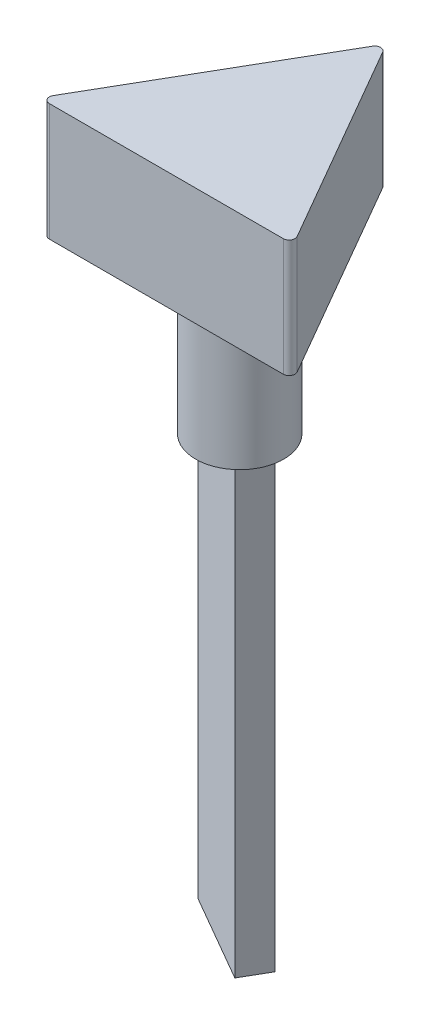
ISO-10303-21;
HEADER;
FILE_DESCRIPTION(('STEP AP214'),'2;1');
FILE_NAME('part.step','',(''),(''),'','','');
FILE_SCHEMA(('AUTOMOTIVE_DESIGN { 1 0 10303 214 1 1 1 1 }'));
ENDSEC;
DATA;
#1=APPLICATION_CONTEXT('core data for automotive mechanical design processes');
#2=APPLICATION_PROTOCOL_DEFINITION('international standard','automotive_design',2000,#1);
#3=PRODUCT_CONTEXT('',#1,'mechanical');
#4=PRODUCT('Part','Part','',(#3));
#5=PRODUCT_RELATED_PRODUCT_CATEGORY('part','',(#4));
#6=PRODUCT_DEFINITION_FORMATION('','',#4);
#7=PRODUCT_DEFINITION_CONTEXT('part definition',#1,'design');
#8=PRODUCT_DEFINITION('design','',#6,#7);
#9=PRODUCT_DEFINITION_SHAPE('','',#8);
#10=(LENGTH_UNIT() NAMED_UNIT(*) SI_UNIT(.MILLI.,.METRE.));
#11=(NAMED_UNIT(*) PLANE_ANGLE_UNIT() SI_UNIT($,.RADIAN.));
#12=(NAMED_UNIT(*) SI_UNIT($,.STERADIAN.) SOLID_ANGLE_UNIT());
#13=UNCERTAINTY_MEASURE_WITH_UNIT(LENGTH_MEASURE(1.E-05),#10,'distance_accuracy_value','');
#14=(GEOMETRIC_REPRESENTATION_CONTEXT(3) GLOBAL_UNCERTAINTY_ASSIGNED_CONTEXT((#13)) GLOBAL_UNIT_ASSIGNED_CONTEXT((#10,
#11,#12)) REPRESENTATION_CONTEXT('',''));
#15=CARTESIAN_POINT('',(0.,0.,0.));
#16=DIRECTION('',(0.,0.,1.));
#17=DIRECTION('',(1.,0.,0.));
#18=AXIS2_PLACEMENT_3D('',#15,#16,#17);
#19=CARTESIAN_POINT('',(0.,-5.,0.));
#20=DIRECTION('',(0.,-1.,0.));
#21=DIRECTION('',(0.,0.,-1.));
#22=AXIS2_PLACEMENT_3D('',#19,#20,#21);
#23=PLANE('',#22);
#24=DIRECTION('',(-0.866025403784439,0.,-0.5));
#25=VECTOR('',#24,1.);
#26=CARTESIAN_POINT('',(-1.98205080756888,-5.,-0.566987298107781));
#27=LINE('',#26,#25);
#28=CARTESIAN_POINT('',(0.974744871391589,-5.,1.14011948307877));
#29=VERTEX_POINT('',#28);
#30=CARTESIAN_POINT('',(-1.47474487139159,-5.,-0.274094079294329));
#31=VERTEX_POINT('',#30);
#32=EDGE_CURVE('E141',#29,#31,#27,.T.);
#33=ORIENTED_EDGE('',*,*,#32,.F.);
#34=CARTESIAN_POINT('',(0.,-5.,0.));
#35=DIRECTION('',(0.,-1.,0.));
#36=DIRECTION('',(0.,0.,-1.));
#37=AXIS2_PLACEMENT_3D('',#34,#35,#36);
#38=CIRCLE('',#37,1.5);
#39=EDGE_CURVE('E156',#29,#31,#38,.T.);
#40=ORIENTED_EDGE('',*,*,#39,.T.);
#41=EDGE_LOOP('',(#33,#40));
#42=FACE_BOUND('',#41,.T.);
#43=ADVANCED_FACE('F35',(#42),#23,.T.);
#44=DIRECTION('',(-0.5,0.,0.866025403784439));
#45=VECTOR('',#44,1.);
#46=CARTESIAN_POINT('',(0.974744871391589,-5.,1.14011948307877));
#47=LINE('',#46,#45);
#48=CARTESIAN_POINT('',(1.47474487139159,-5.,0.274094079294328));
#49=VERTEX_POINT('',#48);
#50=EDGE_CURVE('E265',#49,#29,#47,.T.);
#51=ORIENTED_EDGE('',*,*,#50,.F.);
#52=EDGE_CURVE('E149',#49,#29,#38,.T.);
#53=ORIENTED_EDGE('',*,*,#52,.T.);
#54=EDGE_LOOP('',(#51,#53));
#55=FACE_BOUND('',#54,.T.);
#56=ADVANCED_FACE('F244',(#55),#23,.T.);
#57=CARTESIAN_POINT('',(3.98371685740842,4.,2.3));
#58=DIRECTION('',(0.,-1.,0.));
#59=DIRECTION('',(0.,0.,-1.));
#60=AXIS2_PLACEMENT_3D('',#57,#58,#59);
#61=CYLINDRICAL_SURFACE('',#60,0.2);
#62=CARTESIAN_POINT('',(3.98371685740842,0.,2.3));
#63=DIRECTION('',(0.,1.,0.));
#64=DIRECTION('',(0.,0.,1.));
#65=AXIS2_PLACEMENT_3D('',#62,#63,#64);
#66=CIRCLE('',#65,0.2);
#67=CARTESIAN_POINT('',(3.98371685740842,0.,2.5));
#68=VERTEX_POINT('',#67);
#69=CARTESIAN_POINT('',(4.15692193816531,0.,2.2));
#70=VERTEX_POINT('',#69);
#71=EDGE_CURVE('E155',#68,#70,#66,.T.);
#72=ORIENTED_EDGE('',*,*,#71,.T.);
#73=DIRECTION('',(0.,-1.,0.));
#74=VECTOR('',#73,1.);
#75=CARTESIAN_POINT('',(4.15692193816531,4.,2.2));
#76=LINE('',#75,#74);
#77=CARTESIAN_POINT('',(4.15692193816531,4.,2.2));
#78=VERTEX_POINT('',#77);
#79=EDGE_CURVE('E196',#78,#70,#76,.T.);
#80=ORIENTED_EDGE('',*,*,#79,.F.);
#81=CARTESIAN_POINT('',(3.98371685740842,4.,2.3));
#82=DIRECTION('',(0.,1.,0.));
#83=DIRECTION('',(0.,0.,1.));
#84=AXIS2_PLACEMENT_3D('',#81,#82,#83);
#85=CIRCLE('',#84,0.2);
#86=CARTESIAN_POINT('',(3.98371685740842,4.,2.5));
#87=VERTEX_POINT('',#86);
#88=EDGE_CURVE('E157',#87,#78,#85,.T.);
#89=ORIENTED_EDGE('',*,*,#88,.F.);
#90=DIRECTION('',(0.,-1.,0.));
#91=VECTOR('',#90,1.);
#92=CARTESIAN_POINT('',(3.98371685740842,4.,2.5));
#93=LINE('',#92,#91);
#94=EDGE_CURVE('E171',#87,#68,#93,.T.);
#95=ORIENTED_EDGE('',*,*,#94,.T.);
#96=EDGE_LOOP('',(#72,#80,#89,#95));
#97=FACE_BOUND('',#96,.T.);
#98=ADVANCED_FACE('F37',(#97),#61,.T.);
#99=CARTESIAN_POINT('',(4.15692193816531,4.,2.2));
#100=DIRECTION('',(-0.866025403784439,0.,0.5));
#101=DIRECTION('',(0.5,0.,0.866025403784439));
#102=AXIS2_PLACEMENT_3D('',#99,#100,#101);
#103=PLANE('',#102);
#104=DIRECTION('',(-0.5,0.,-0.866025403784439));
#105=VECTOR('',#104,1.);
#106=CARTESIAN_POINT('',(4.15692193816531,0.,2.2));
#107=LINE('',#106,#105);
#108=CARTESIAN_POINT('',(0.173205080756888,0.,-4.70000000000001));
#109=VERTEX_POINT('',#108);
#110=EDGE_CURVE('E174',#70,#109,#107,.T.);
#111=ORIENTED_EDGE('',*,*,#110,.T.);
#112=DIRECTION('',(0.,-1.,0.));
#113=VECTOR('',#112,1.);
#114=CARTESIAN_POINT('',(0.173205080756888,4.,-4.70000000000001));
#115=LINE('',#114,#113);
#116=CARTESIAN_POINT('',(0.173205080756888,4.,-4.70000000000001));
#117=VERTEX_POINT('',#116);
#118=EDGE_CURVE('E194',#117,#109,#115,.T.);
#119=ORIENTED_EDGE('',*,*,#118,.F.);
#120=DIRECTION('',(-0.5,0.,-0.866025403784439));
#121=VECTOR('',#120,1.);
#122=CARTESIAN_POINT('',(4.15692193816531,4.,2.2));
#123=LINE('',#122,#121);
#124=EDGE_CURVE('E160',#78,#117,#123,.T.);
#125=ORIENTED_EDGE('',*,*,#124,.F.);
#126=ORIENTED_EDGE('',*,*,#79,.T.);
#127=EDGE_LOOP('',(#111,#119,#125,#126));
#128=FACE_BOUND('',#127,.T.);
#129=ADVANCED_FACE('F234',(#128),#103,.F.);
#130=CARTESIAN_POINT('',(0.,4.,-4.6));
#131=DIRECTION('',(0.,-1.,0.));
#132=DIRECTION('',(0.,0.,-1.));
#133=AXIS2_PLACEMENT_3D('',#130,#131,#132);
#134=CYLINDRICAL_SURFACE('',#133,0.200000000000001);
#135=CARTESIAN_POINT('',(0.,0.,-4.6));
#136=DIRECTION('',(0.,1.,0.));
#137=DIRECTION('',(0.,0.,1.));
#138=AXIS2_PLACEMENT_3D('',#135,#136,#137);
#139=CIRCLE('',#138,0.200000000000001);
#140=CARTESIAN_POINT('',(-0.173205080756889,0.,-4.70000000000001));
#141=VERTEX_POINT('',#140);
#142=EDGE_CURVE('E176',#109,#141,#139,.T.);
#143=ORIENTED_EDGE('',*,*,#142,.T.);
#144=DIRECTION('',(0.,-1.,0.));
#145=VECTOR('',#144,1.);
#146=CARTESIAN_POINT('',(-0.173205080756889,4.,-4.70000000000001));
#147=LINE('',#146,#145);
#148=CARTESIAN_POINT('',(-0.173205080756889,4.,-4.70000000000001));
#149=VERTEX_POINT('',#148);
#150=EDGE_CURVE('E191',#149,#141,#147,.T.);
#151=ORIENTED_EDGE('',*,*,#150,.F.);
#152=CARTESIAN_POINT('',(0.,4.,-4.6));
#153=DIRECTION('',(0.,1.,0.));
#154=DIRECTION('',(0.,0.,1.));
#155=AXIS2_PLACEMENT_3D('',#152,#153,#154);
#156=CIRCLE('',#155,0.200000000000001);
#157=EDGE_CURVE('E163',#117,#149,#156,.T.);
#158=ORIENTED_EDGE('',*,*,#157,.F.);
#159=ORIENTED_EDGE('',*,*,#118,.T.);
#160=EDGE_LOOP('',(#143,#151,#158,#159));
#161=FACE_BOUND('',#160,.T.);
#162=ADVANCED_FACE('F232',(#161),#134,.T.);
#163=CARTESIAN_POINT('',(-0.173205080756889,4.,-4.70000000000001));
#164=DIRECTION('',(0.866025403784439,0.,0.5));
#165=DIRECTION('',(0.5,0.,-0.866025403784439));
#166=AXIS2_PLACEMENT_3D('',#163,#164,#165);
#167=PLANE('',#166);
#168=DIRECTION('',(-0.5,0.,0.866025403784439));
#169=VECTOR('',#168,1.);
#170=CARTESIAN_POINT('',(-0.173205080756889,0.,-4.70000000000001));
#171=LINE('',#170,#169);
#172=CARTESIAN_POINT('',(-4.15692193816531,0.,2.20000000000001));
#173=VERTEX_POINT('',#172);
#174=EDGE_CURVE('E178',#141,#173,#171,.T.);
#175=ORIENTED_EDGE('',*,*,#174,.T.);
#176=DIRECTION('',(0.,-1.,0.));
#177=VECTOR('',#176,1.);
#178=CARTESIAN_POINT('',(-4.15692193816531,4.,2.20000000000001));
#179=LINE('',#178,#177);
#180=CARTESIAN_POINT('',(-4.15692193816531,4.,2.20000000000001));
#181=VERTEX_POINT('',#180);
#182=EDGE_CURVE('E188',#181,#173,#179,.T.);
#183=ORIENTED_EDGE('',*,*,#182,.F.);
#184=DIRECTION('',(-0.5,0.,0.866025403784439));
#185=VECTOR('',#184,1.);
#186=CARTESIAN_POINT('',(-0.173205080756889,4.,-4.70000000000001));
#187=LINE('',#186,#185);
#188=EDGE_CURVE('E165',#149,#181,#187,.T.);
#189=ORIENTED_EDGE('',*,*,#188,.F.);
#190=ORIENTED_EDGE('',*,*,#150,.T.);
#191=EDGE_LOOP('',(#175,#183,#189,#190));
#192=FACE_BOUND('',#191,.T.);
#193=ADVANCED_FACE('F227',(#192),#167,.F.);
#194=CARTESIAN_POINT('',(-3.98371685740842,4.,2.3));
#195=DIRECTION('',(0.,-1.,0.));
#196=DIRECTION('',(0.,0.,-1.));
#197=AXIS2_PLACEMENT_3D('',#194,#195,#196);
#198=CYLINDRICAL_SURFACE('',#197,0.2);
#199=CARTESIAN_POINT('',(-3.98371685740842,0.,2.3));
#200=DIRECTION('',(0.,1.,0.));
#201=DIRECTION('',(0.,0.,-1.));
#202=AXIS2_PLACEMENT_3D('',#199,#200,#201);
#203=CIRCLE('',#202,0.2);
#204=CARTESIAN_POINT('',(-3.98371685740842,0.,2.5));
#205=VERTEX_POINT('',#204);
#206=EDGE_CURVE('E180',#173,#205,#203,.T.);
#207=ORIENTED_EDGE('',*,*,#206,.T.);
#208=DIRECTION('',(0.,-1.,0.));
#209=VECTOR('',#208,1.);
#210=CARTESIAN_POINT('',(-3.98371685740842,4.,2.5));
#211=LINE('',#210,#209);
#212=CARTESIAN_POINT('',(-3.98371685740842,4.,2.5));
#213=VERTEX_POINT('',#212);
#214=EDGE_CURVE('E185',#213,#205,#211,.T.);
#215=ORIENTED_EDGE('',*,*,#214,.F.);
#216=CARTESIAN_POINT('',(-3.98371685740842,4.,2.3));
#217=DIRECTION('',(0.,1.,0.));
#218=DIRECTION('',(0.,0.,-1.));
#219=AXIS2_PLACEMENT_3D('',#216,#217,#218);
#220=CIRCLE('',#219,0.2);
#221=EDGE_CURVE('E167',#181,#213,#220,.T.);
#222=ORIENTED_EDGE('',*,*,#221,.F.);
#223=ORIENTED_EDGE('',*,*,#182,.T.);
#224=EDGE_LOOP('',(#207,#215,#222,#223));
#225=FACE_BOUND('',#224,.T.);
#226=ADVANCED_FACE('F223',(#225),#198,.T.);
#227=CARTESIAN_POINT('',(-3.98371685740842,4.,2.5));
#228=DIRECTION('',(0.,0.,-1.));
#229=DIRECTION('',(-1.,0.,0.));
#230=AXIS2_PLACEMENT_3D('',#227,#228,#229);
#231=PLANE('',#230);
#232=DIRECTION('',(1.,0.,0.));
#233=VECTOR('',#232,1.);
#234=CARTESIAN_POINT('',(-3.98371685740842,0.,2.5));
#235=LINE('',#234,#233);
#236=EDGE_CURVE('E161',#205,#68,#235,.T.);
#237=ORIENTED_EDGE('',*,*,#236,.T.);
#238=ORIENTED_EDGE('',*,*,#94,.F.);
#239=DIRECTION('',(1.,0.,0.));
#240=VECTOR('',#239,1.);
#241=CARTESIAN_POINT('',(-3.98371685740842,4.,2.5));
#242=LINE('',#241,#240);
#243=EDGE_CURVE('E169',#213,#87,#242,.T.);
#244=ORIENTED_EDGE('',*,*,#243,.F.);
#245=ORIENTED_EDGE('',*,*,#214,.T.);
#246=EDGE_LOOP('',(#237,#238,#244,#245));
#247=FACE_BOUND('',#246,.T.);
#248=ADVANCED_FACE('F219',(#247),#231,.F.);
#249=CARTESIAN_POINT('',(3.98371685740842,4.,2.3));
#250=DIRECTION('',(0.,1.,0.));
#251=DIRECTION('',(0.,0.,1.));
#252=AXIS2_PLACEMENT_3D('',#249,#250,#251);
#253=PLANE('',#252);
#254=ORIENTED_EDGE('',*,*,#88,.T.);
#255=ORIENTED_EDGE('',*,*,#124,.T.);
#256=ORIENTED_EDGE('',*,*,#157,.T.);
#257=ORIENTED_EDGE('',*,*,#188,.T.);
#258=ORIENTED_EDGE('',*,*,#221,.T.);
#259=ORIENTED_EDGE('',*,*,#243,.T.);
#260=EDGE_LOOP('',(#254,#255,#256,#257,#258,#259));
#261=FACE_BOUND('',#260,.T.);
#262=ADVANCED_FACE('F208',(#261),#253,.T.);
#263=CARTESIAN_POINT('',(3.98371685740842,0.,2.3));
#264=DIRECTION('',(0.,1.,0.));
#265=DIRECTION('',(0.,0.,1.));
#266=AXIS2_PLACEMENT_3D('',#263,#264,#265);
#267=PLANE('',#266);
#268=CARTESIAN_POINT('',(0.,0.,0.));
#269=DIRECTION('',(0.,1.,0.));
#270=DIRECTION('',(0.,0.,1.));
#271=AXIS2_PLACEMENT_3D('',#268,#269,#270);
#272=CIRCLE('',#271,1.5);
#273=CARTESIAN_POINT('',(0.,0.,1.5));
#274=VERTEX_POINT('',#273);
#275=EDGE_CURVE('E39',#274,#274,#272,.F.);
#276=ORIENTED_EDGE('',*,*,#275,.F.);
#277=EDGE_LOOP('',(#276));
#278=FACE_BOUND('',#277,.T.);
#279=ORIENTED_EDGE('',*,*,#71,.F.);
#280=ORIENTED_EDGE('',*,*,#236,.F.);
#281=ORIENTED_EDGE('',*,*,#206,.F.);
#282=ORIENTED_EDGE('',*,*,#174,.F.);
#283=ORIENTED_EDGE('',*,*,#142,.F.);
#284=ORIENTED_EDGE('',*,*,#110,.F.);
#285=EDGE_LOOP('',(#279,#280,#281,#282,#283,#284));
#286=FACE_BOUND('',#285,.T.);
#287=ADVANCED_FACE('F205',(#278,#286),#267,.F.);
#288=CARTESIAN_POINT('',(0.,-5.,0.));
#289=DIRECTION('',(0.,1.,0.));
#290=DIRECTION('',(0.,0.,1.));
#291=AXIS2_PLACEMENT_3D('',#288,#289,#290);
#292=CYLINDRICAL_SURFACE('',#291,1.5);
#293=ORIENTED_EDGE('',*,*,#52,.F.);
#294=CARTESIAN_POINT('',(-0.974744871391589,-5.,-1.14011948307877));
#295=VERTEX_POINT('',#294);
#296=EDGE_CURVE('E146',#295,#49,#38,.T.);
#297=ORIENTED_EDGE('',*,*,#296,.F.);
#298=EDGE_CURVE('E56',#31,#295,#38,.T.);
#299=ORIENTED_EDGE('',*,*,#298,.F.);
#300=ORIENTED_EDGE('',*,*,#39,.F.);
#301=EDGE_LOOP('',(#293,#297,#299,#300));
#302=FACE_BOUND('',#301,.T.);
#303=ORIENTED_EDGE('',*,*,#275,.T.);
#304=EDGE_LOOP('',(#303));
#305=FACE_BOUND('',#304,.T.);
#306=ADVANCED_FACE('F203',(#302,#305),#292,.T.);
#307=DIRECTION('',(0.866025403784439,0.,0.5));
#308=VECTOR('',#307,1.);
#309=CARTESIAN_POINT('',(-1.48205080756888,-5.,-1.43301270189222));
#310=LINE('',#309,#308);
#311=EDGE_CURVE('E11',#295,#49,#310,.T.);
#312=ORIENTED_EDGE('',*,*,#311,.F.);
#313=ORIENTED_EDGE('',*,*,#296,.T.);
#314=EDGE_LOOP('',(#312,#313));
#315=FACE_BOUND('',#314,.T.);
#316=ADVANCED_FACE('F247',(#315),#23,.T.);
#317=CARTESIAN_POINT('',(0.,-5.,0.));
#318=DIRECTION('',(0.,-1.,0.));
#319=DIRECTION('',(0.,0.,-1.));
#320=AXIS2_PLACEMENT_3D('',#317,#318,#319);
#321=PLANE('',#320);
#322=CARTESIAN_POINT('',(-1.98205080756888,-5.,-0.566987298107781));
#323=VERTEX_POINT('',#322);
#324=EDGE_CURVE('E269',#31,#323,#27,.T.);
#325=ORIENTED_EDGE('',*,*,#324,.F.);
#326=ORIENTED_EDGE('',*,*,#298,.T.);
#327=CARTESIAN_POINT('',(-1.48205080756888,-5.,-1.43301270189222));
#328=VERTEX_POINT('',#327);
#329=EDGE_CURVE('E45',#328,#295,#310,.T.);
#330=ORIENTED_EDGE('',*,*,#329,.F.);
#331=DIRECTION('',(0.5,0.,-0.866025403784439));
#332=VECTOR('',#331,1.);
#333=CARTESIAN_POINT('',(-1.98205080756888,-5.,-0.566987298107781));
#334=LINE('',#333,#332);
#335=EDGE_CURVE('E145',#323,#328,#334,.T.);
#336=ORIENTED_EDGE('',*,*,#335,.F.);
#337=EDGE_LOOP('',(#325,#326,#330,#336));
#338=FACE_BOUND('',#337,.T.);
#339=ADVANCED_FACE('F254',(#338),#321,.F.);
#340=CARTESIAN_POINT('',(-1.98205080756888,-20.,-0.566987298107781));
#341=DIRECTION('',(0.866025403784438,0.,0.5));
#342=DIRECTION('',(0.5,0.,-0.866025403784439));
#343=AXIS2_PLACEMENT_3D('',#340,#341,#342);
#344=PLANE('',#343);
#345=ORIENTED_EDGE('',*,*,#335,.T.);
#346=DIRECTION('',(0.,1.,0.));
#347=VECTOR('',#346,1.);
#348=CARTESIAN_POINT('',(-1.48205080756888,-20.,-1.43301270189222));
#349=LINE('',#348,#347);
#350=CARTESIAN_POINT('',(-1.48205080756888,-20.,-1.43301270189222));
#351=VERTEX_POINT('',#350);
#352=EDGE_CURVE('E125',#351,#328,#349,.T.);
#353=ORIENTED_EDGE('',*,*,#352,.F.);
#354=DIRECTION('',(0.5,0.,-0.866025403784439));
#355=VECTOR('',#354,1.);
#356=CARTESIAN_POINT('',(-1.98205080756888,-20.,-0.566987298107781));
#357=LINE('',#356,#355);
#358=CARTESIAN_POINT('',(-1.98205080756888,-20.,-0.566987298107781));
#359=VERTEX_POINT('',#358);
#360=EDGE_CURVE('E132',#359,#351,#357,.T.);
#361=ORIENTED_EDGE('',*,*,#360,.F.);
#362=DIRECTION('',(0.,1.,0.));
#363=VECTOR('',#362,1.);
#364=CARTESIAN_POINT('',(-1.98205080756888,-20.,-0.566987298107781));
#365=LINE('',#364,#363);
#366=EDGE_CURVE('E273',#359,#323,#365,.T.);
#367=ORIENTED_EDGE('',*,*,#366,.T.);
#368=EDGE_LOOP('',(#345,#353,#361,#367));
#369=FACE_BOUND('',#368,.T.);
#370=ADVANCED_FACE('F143',(#369),#344,.F.);
#371=CARTESIAN_POINT('',(-1.48205080756888,-20.,-1.43301270189222));
#372=DIRECTION('',(-0.5,0.,0.866025403784439));
#373=DIRECTION('',(0.866025403784439,0.,0.5));
#374=AXIS2_PLACEMENT_3D('',#371,#372,#373);
#375=PLANE('',#374);
#376=ORIENTED_EDGE('',*,*,#329,.T.);
#377=ORIENTED_EDGE('',*,*,#311,.T.);
#378=DIRECTION('',(0.,1.,0.));
#379=VECTOR('',#378,1.);
#380=CARTESIAN_POINT('',(1.47474487139159,-20.,0.274094079294328));
#381=LINE('',#380,#379);
#382=CARTESIAN_POINT('',(1.47474487139159,-20.,0.274094079294328));
#383=VERTEX_POINT('',#382);
#384=EDGE_CURVE('E128',#383,#49,#381,.T.);
#385=ORIENTED_EDGE('',*,*,#384,.F.);
#386=DIRECTION('',(0.866025403784439,0.,0.5));
#387=VECTOR('',#386,1.);
#388=CARTESIAN_POINT('',(-1.48205080756888,-20.,-1.43301270189222));
#389=LINE('',#388,#387);
#390=EDGE_CURVE('E120',#351,#383,#389,.T.);
#391=ORIENTED_EDGE('',*,*,#390,.F.);
#392=ORIENTED_EDGE('',*,*,#352,.T.);
#393=EDGE_LOOP('',(#376,#377,#385,#391,#392));
#394=FACE_BOUND('',#393,.T.);
#395=ADVANCED_FACE('F123',(#394),#375,.F.);
#396=CARTESIAN_POINT('',(0.974744871391589,-20.,1.14011948307877));
#397=DIRECTION('',(-0.866025403784439,0.,-0.5));
#398=DIRECTION('',(-0.5,0.,0.866025403784439));
#399=AXIS2_PLACEMENT_3D('',#396,#397,#398);
#400=PLANE('',#399);
#401=ORIENTED_EDGE('',*,*,#50,.T.);
#402=DIRECTION('',(0.,1.,0.));
#403=VECTOR('',#402,1.);
#404=CARTESIAN_POINT('',(0.974744871391589,-20.,1.14011948307877));
#405=LINE('',#404,#403);
#406=CARTESIAN_POINT('',(0.974744871391589,-20.,1.14011948307877));
#407=VERTEX_POINT('',#406);
#408=EDGE_CURVE('E150',#407,#29,#405,.T.);
#409=ORIENTED_EDGE('',*,*,#408,.F.);
#410=DIRECTION('',(-0.5,0.,0.866025403784439));
#411=VECTOR('',#410,1.);
#412=CARTESIAN_POINT('',(0.974744871391589,-20.,1.14011948307877));
#413=LINE('',#412,#411);
#414=EDGE_CURVE('E131',#383,#407,#413,.T.);
#415=ORIENTED_EDGE('',*,*,#414,.F.);
#416=ORIENTED_EDGE('',*,*,#384,.T.);
#417=EDGE_LOOP('',(#401,#409,#415,#416));
#418=FACE_BOUND('',#417,.T.);
#419=ADVANCED_FACE('F271',(#418),#400,.F.);
#420=CARTESIAN_POINT('',(-1.98205080756888,-20.,-0.566987298107781));
#421=DIRECTION('',(0.5,0.,-0.866025403784439));
#422=DIRECTION('',(-0.866025403784439,0.,-0.5));
#423=AXIS2_PLACEMENT_3D('',#420,#421,#422);
#424=PLANE('',#423);
#425=ORIENTED_EDGE('',*,*,#32,.T.);
#426=ORIENTED_EDGE('',*,*,#324,.T.);
#427=ORIENTED_EDGE('',*,*,#366,.F.);
#428=DIRECTION('',(-0.866025403784439,0.,-0.5));
#429=VECTOR('',#428,1.);
#430=CARTESIAN_POINT('',(-1.98205080756888,-20.,-0.566987298107781));
#431=LINE('',#430,#429);
#432=EDGE_CURVE('E137',#407,#359,#431,.T.);
#433=ORIENTED_EDGE('',*,*,#432,.F.);
#434=ORIENTED_EDGE('',*,*,#408,.T.);
#435=EDGE_LOOP('',(#425,#426,#427,#433,#434));
#436=FACE_BOUND('',#435,.T.);
#437=ADVANCED_FACE('F280',(#436),#424,.F.);
#438=CARTESIAN_POINT('',(0.,-20.,0.));
#439=DIRECTION('',(0.,-1.,0.));
#440=DIRECTION('',(0.,0.,-1.));
#441=AXIS2_PLACEMENT_3D('',#438,#439,#440);
#442=PLANE('',#441);
#443=ORIENTED_EDGE('',*,*,#360,.T.);
#444=ORIENTED_EDGE('',*,*,#390,.T.);
#445=ORIENTED_EDGE('',*,*,#414,.T.);
#446=ORIENTED_EDGE('',*,*,#432,.T.);
#447=EDGE_LOOP('',(#443,#444,#445,#446));
#448=FACE_BOUND('',#447,.T.);
#449=ADVANCED_FACE('F135',(#448),#442,.T.);
#450=CLOSED_SHELL('',(#43,#56,#98,#129,#162,#193,#226,#248,#262,#287,#306,#316,#339,#370,#395,
#419,#437,#449));
#451=MANIFOLD_SOLID_BREP('B2',#450);
#452=ADVANCED_BREP_SHAPE_REPRESENTATION('',(#18,#451),#14);
#453=SHAPE_DEFINITION_REPRESENTATION(#9,#452);
ENDSEC;
END-ISO-10303-21;
